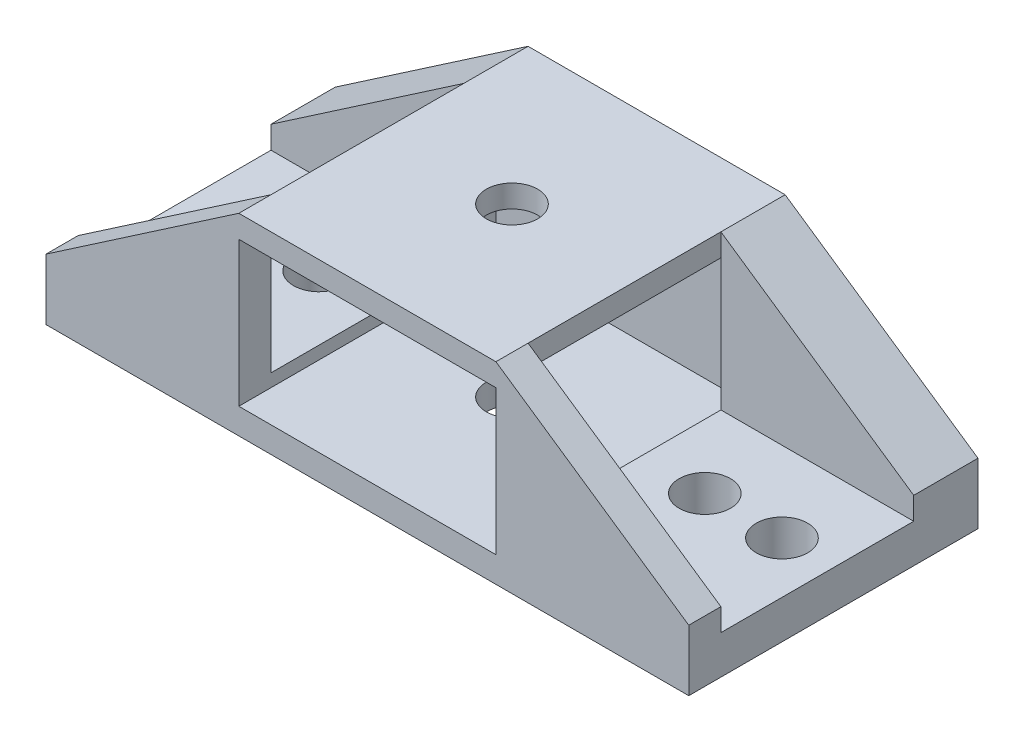
ISO-10303-21;
HEADER;
FILE_DESCRIPTION(('STEP AP214'),'2;1');
FILE_NAME('part.step','',(''),(''),'','','');
FILE_SCHEMA(('AUTOMOTIVE_DESIGN { 1 0 10303 214 1 1 1 1 }'));
ENDSEC;
DATA;
#1=APPLICATION_CONTEXT('core data for automotive mechanical design processes');
#2=APPLICATION_PROTOCOL_DEFINITION('international standard','automotive_design',2000,#1);
#3=PRODUCT_CONTEXT('',#1,'mechanical');
#4=PRODUCT('Part','Part','',(#3));
#5=PRODUCT_RELATED_PRODUCT_CATEGORY('part','',(#4));
#6=PRODUCT_DEFINITION_FORMATION('','',#4);
#7=PRODUCT_DEFINITION_CONTEXT('part definition',#1,'design');
#8=PRODUCT_DEFINITION('design','',#6,#7);
#9=PRODUCT_DEFINITION_SHAPE('','',#8);
#10=(LENGTH_UNIT() NAMED_UNIT(*) SI_UNIT(.MILLI.,.METRE.));
#11=(NAMED_UNIT(*) PLANE_ANGLE_UNIT() SI_UNIT($,.RADIAN.));
#12=(NAMED_UNIT(*) SI_UNIT($,.STERADIAN.) SOLID_ANGLE_UNIT());
#13=UNCERTAINTY_MEASURE_WITH_UNIT(LENGTH_MEASURE(1.E-05),#10,'distance_accuracy_value','');
#14=(GEOMETRIC_REPRESENTATION_CONTEXT(3) GLOBAL_UNCERTAINTY_ASSIGNED_CONTEXT((#13)) GLOBAL_UNIT_ASSIGNED_CONTEXT((#10,
#11,#12)) REPRESENTATION_CONTEXT('',''));
#15=CARTESIAN_POINT('',(0.,0.,0.));
#16=DIRECTION('',(0.,0.,1.));
#17=DIRECTION('',(1.,0.,0.));
#18=AXIS2_PLACEMENT_3D('',#15,#16,#17);
#19=CARTESIAN_POINT('',(0.,3.,0.));
#20=DIRECTION('',(0.,0.,-1.));
#21=DIRECTION('',(-1.,0.,0.));
#22=AXIS2_PLACEMENT_3D('',#19,#20,#21);
#23=PLANE('',#22);
#24=DIRECTION('',(1.,0.,0.));
#25=VECTOR('',#24,1.);
#26=CARTESIAN_POINT('',(0.,2.,0.));
#27=LINE('',#26,#25);
#28=CARTESIAN_POINT('',(15.,2.,0.));
#29=VERTEX_POINT('',#28);
#30=CARTESIAN_POINT('',(35.,2.,0.));
#31=VERTEX_POINT('',#30);
#32=EDGE_CURVE('E260',#29,#31,#27,.T.);
#33=ORIENTED_EDGE('',*,*,#32,.F.);
#34=DIRECTION('',(0.,-1.,0.));
#35=VECTOR('',#34,1.);
#36=CARTESIAN_POINT('',(15.,0.,0.));
#37=LINE('',#36,#35);
#38=CARTESIAN_POINT('',(15.,13.25,0.));
#39=VERTEX_POINT('',#38);
#40=EDGE_CURVE('E242',#39,#29,#37,.T.);
#41=ORIENTED_EDGE('',*,*,#40,.F.);
#42=DIRECTION('',(1.,0.,0.));
#43=VECTOR('',#42,1.);
#44=CARTESIAN_POINT('',(0.,13.25,0.));
#45=LINE('',#44,#43);
#46=CARTESIAN_POINT('',(35.,13.25,0.));
#47=VERTEX_POINT('',#46);
#48=EDGE_CURVE('E249',#39,#47,#45,.T.);
#49=ORIENTED_EDGE('',*,*,#48,.T.);
#50=DIRECTION('',(0.,1.,0.));
#51=VECTOR('',#50,1.);
#52=CARTESIAN_POINT('',(35.,0.,0.));
#53=LINE('',#52,#51);
#54=EDGE_CURVE('E263',#31,#47,#53,.T.);
#55=ORIENTED_EDGE('',*,*,#54,.F.);
#56=EDGE_LOOP('',(#33,#41,#49,#55));
#57=FACE_BOUND('',#56,.T.);
#58=DIRECTION('',(0.,-1.,0.));
#59=VECTOR('',#58,1.);
#60=CARTESIAN_POINT('',(50.,3.,0.));
#61=LINE('',#60,#59);
#62=CARTESIAN_POINT('',(50.,4.75000000000001,0.));
#63=VERTEX_POINT('',#62);
#64=CARTESIAN_POINT('',(50.,0.,0.));
#65=VERTEX_POINT('',#64);
#66=EDGE_CURVE('E197',#63,#65,#61,.T.);
#67=ORIENTED_EDGE('',*,*,#66,.F.);
#68=DIRECTION('',(0.825644641500814,-0.564190505025556,0.));
#69=VECTOR('',#68,1.);
#70=CARTESIAN_POINT('',(18.1281954175345,26.5290664646847,0.));
#71=LINE('',#70,#69);
#72=CARTESIAN_POINT('',(35.,15.,0.));
#73=VERTEX_POINT('',#72);
#74=EDGE_CURVE('E191',#73,#63,#71,.T.);
#75=ORIENTED_EDGE('',*,*,#74,.F.);
#76=DIRECTION('',(1.,0.,0.));
#77=VECTOR('',#76,1.);
#78=CARTESIAN_POINT('',(0.,15.,0.));
#79=LINE('',#78,#77);
#80=CARTESIAN_POINT('',(15.,15.,0.));
#81=VERTEX_POINT('',#80);
#82=EDGE_CURVE('E287',#81,#73,#79,.T.);
#83=ORIENTED_EDGE('',*,*,#82,.F.);
#84=DIRECTION('',(-0.825644641500814,-0.564190505025556,0.));
#85=VECTOR('',#84,1.);
#86=CARTESIAN_POINT('',(-2.21264911948495,3.23802310168529,0.));
#87=LINE('',#86,#85);
#88=CARTESIAN_POINT('',(0.,4.75000000000001,0.));
#89=VERTEX_POINT('',#88);
#90=EDGE_CURVE('E335',#81,#89,#87,.T.);
#91=ORIENTED_EDGE('',*,*,#90,.T.);
#92=DIRECTION('',(0.,-1.,0.));
#93=VECTOR('',#92,1.);
#94=CARTESIAN_POINT('',(0.,3.,0.));
#95=LINE('',#94,#93);
#96=CARTESIAN_POINT('',(0.,0.,0.));
#97=VERTEX_POINT('',#96);
#98=EDGE_CURVE('E201',#89,#97,#95,.T.);
#99=ORIENTED_EDGE('',*,*,#98,.T.);
#100=DIRECTION('',(1.,0.,0.));
#101=VECTOR('',#100,1.);
#102=CARTESIAN_POINT('',(0.,0.,0.));
#103=LINE('',#102,#101);
#104=EDGE_CURVE('E294',#97,#65,#103,.T.);
#105=ORIENTED_EDGE('',*,*,#104,.T.);
#106=EDGE_LOOP('',(#67,#75,#83,#91,#99,#105));
#107=FACE_BOUND('',#106,.T.);
#108=ADVANCED_FACE('F35',(#57,#107),#23,.F.);
#109=CARTESIAN_POINT('',(0.,3.,-22.5));
#110=DIRECTION('',(0.,0.,-1.));
#111=DIRECTION('',(-1.,0.,0.));
#112=AXIS2_PLACEMENT_3D('',#109,#110,#111);
#113=PLANE('',#112);
#114=DIRECTION('',(0.825644641500814,-0.564190505025556,0.));
#115=VECTOR('',#114,1.);
#116=CARTESIAN_POINT('',(18.1281954175345,26.5290664646847,-22.5));
#117=LINE('',#116,#115);
#118=CARTESIAN_POINT('',(35.,15.,-22.5));
#119=VERTEX_POINT('',#118);
#120=CARTESIAN_POINT('',(50.,4.75000000000001,-22.5));
#121=VERTEX_POINT('',#120);
#122=EDGE_CURVE('E173',#119,#121,#117,.T.);
#123=ORIENTED_EDGE('',*,*,#122,.T.);
#124=DIRECTION('',(0.,-1.,0.));
#125=VECTOR('',#124,1.);
#126=CARTESIAN_POINT('',(50.,3.,-22.5));
#127=LINE('',#126,#125);
#128=CARTESIAN_POINT('',(50.,0.,-22.5));
#129=VERTEX_POINT('',#128);
#130=EDGE_CURVE('E186',#121,#129,#127,.T.);
#131=ORIENTED_EDGE('',*,*,#130,.T.);
#132=DIRECTION('',(1.,0.,0.));
#133=VECTOR('',#132,1.);
#134=CARTESIAN_POINT('',(0.,0.,-22.5));
#135=LINE('',#134,#133);
#136=CARTESIAN_POINT('',(0.,0.,-22.5));
#137=VERTEX_POINT('',#136);
#138=EDGE_CURVE('E316',#137,#129,#135,.T.);
#139=ORIENTED_EDGE('',*,*,#138,.F.);
#140=DIRECTION('',(0.,-1.,0.));
#141=VECTOR('',#140,1.);
#142=CARTESIAN_POINT('',(0.,3.,-22.5));
#143=LINE('',#142,#141);
#144=CARTESIAN_POINT('',(0.,4.75000000000001,-22.5));
#145=VERTEX_POINT('',#144);
#146=EDGE_CURVE('E198',#145,#137,#143,.T.);
#147=ORIENTED_EDGE('',*,*,#146,.F.);
#148=DIRECTION('',(-0.825644641500814,-0.564190505025556,0.));
#149=VECTOR('',#148,1.);
#150=CARTESIAN_POINT('',(-2.21264911948495,3.23802310168529,-22.5));
#151=LINE('',#150,#149);
#152=CARTESIAN_POINT('',(15.,15.,-22.5));
#153=VERTEX_POINT('',#152);
#154=EDGE_CURVE('E224',#153,#145,#151,.T.);
#155=ORIENTED_EDGE('',*,*,#154,.F.);
#156=DIRECTION('',(1.,0.,0.));
#157=VECTOR('',#156,1.);
#158=CARTESIAN_POINT('',(0.,15.,-22.5));
#159=LINE('',#158,#157);
#160=EDGE_CURVE('E190',#153,#119,#159,.T.);
#161=ORIENTED_EDGE('',*,*,#160,.T.);
#162=EDGE_LOOP('',(#123,#131,#139,#147,#155,#161));
#163=FACE_BOUND('',#162,.T.);
#164=ADVANCED_FACE('F184',(#163),#113,.T.);
#165=CARTESIAN_POINT('',(0.,3.,0.));
#166=DIRECTION('',(-1.,0.,0.));
#167=DIRECTION('',(0.,0.,1.));
#168=AXIS2_PLACEMENT_3D('',#165,#166,#167);
#169=PLANE('',#168);
#170=ORIENTED_EDGE('',*,*,#98,.F.);
#171=DIRECTION('',(0.,0.,1.));
#172=VECTOR('',#171,1.);
#173=CARTESIAN_POINT('',(0.,4.75000000000001,-40.6676222990242));
#174=LINE('',#173,#172);
#175=CARTESIAN_POINT('',(0.,4.75000000000001,-2.5));
#176=VERTEX_POINT('',#175);
#177=EDGE_CURVE('E209',#176,#89,#174,.T.);
#178=ORIENTED_EDGE('',*,*,#177,.F.);
#179=DIRECTION('',(0.,-1.,0.));
#180=VECTOR('',#179,1.);
#181=CARTESIAN_POINT('',(0.,30.8113883008419,-2.5));
#182=LINE('',#181,#180);
#183=CARTESIAN_POINT('',(0.,3.,-2.5));
#184=VERTEX_POINT('',#183);
#185=EDGE_CURVE('E221',#176,#184,#182,.T.);
#186=ORIENTED_EDGE('',*,*,#185,.T.);
#187=DIRECTION('',(0.,0.,-1.));
#188=VECTOR('',#187,1.);
#189=CARTESIAN_POINT('',(0.,3.,0.));
#190=LINE('',#189,#188);
#191=CARTESIAN_POINT('',(0.,3.,-17.5));
#192=VERTEX_POINT('',#191);
#193=EDGE_CURVE('E298',#184,#192,#190,.T.);
#194=ORIENTED_EDGE('',*,*,#193,.T.);
#195=DIRECTION('',(0.,-1.,0.));
#196=VECTOR('',#195,1.);
#197=CARTESIAN_POINT('',(0.,30.8113883008419,-17.5));
#198=LINE('',#197,#196);
#199=CARTESIAN_POINT('',(0.,4.75000000000001,-17.5));
#200=VERTEX_POINT('',#199);
#201=EDGE_CURVE('E231',#200,#192,#198,.T.);
#202=ORIENTED_EDGE('',*,*,#201,.F.);
#203=EDGE_CURVE('E57',#145,#200,#174,.T.);
#204=ORIENTED_EDGE('',*,*,#203,.F.);
#205=ORIENTED_EDGE('',*,*,#146,.T.);
#206=DIRECTION('',(0.,0.,-1.));
#207=VECTOR('',#206,1.);
#208=CARTESIAN_POINT('',(0.,0.,0.));
#209=LINE('',#208,#207);
#210=EDGE_CURVE('E318',#97,#137,#209,.T.);
#211=ORIENTED_EDGE('',*,*,#210,.F.);
#212=EDGE_LOOP('',(#170,#178,#186,#194,#202,#204,#205,#211));
#213=FACE_BOUND('',#212,.T.);
#214=ADVANCED_FACE('F219',(#213),#169,.T.);
#215=CARTESIAN_POINT('',(0.,15.,0.));
#216=DIRECTION('',(0.,1.,0.));
#217=DIRECTION('',(0.,0.,1.));
#218=AXIS2_PLACEMENT_3D('',#215,#216,#217);
#219=PLANE('',#218);
#220=CARTESIAN_POINT('',(25.,15.,-11.25));
#221=DIRECTION('',(0.,1.,0.));
#222=DIRECTION('',(0.,0.,1.));
#223=AXIS2_PLACEMENT_3D('',#220,#221,#222);
#224=CIRCLE('',#223,2.);
#225=CARTESIAN_POINT('',(25.,15.,-9.25));
#226=VERTEX_POINT('',#225);
#227=EDGE_CURVE('E388',#226,#226,#224,.T.);
#228=ORIENTED_EDGE('',*,*,#227,.F.);
#229=EDGE_LOOP('',(#228));
#230=FACE_BOUND('',#229,.T.);
#231=DIRECTION('',(0.,0.,1.));
#232=VECTOR('',#231,1.);
#233=CARTESIAN_POINT('',(35.,15.,-40.6676222990242));
#234=LINE('',#233,#232);
#235=CARTESIAN_POINT('',(35.,15.,-17.5));
#236=VERTEX_POINT('',#235);
#237=EDGE_CURVE('E348',#119,#236,#234,.T.);
#238=ORIENTED_EDGE('',*,*,#237,.F.);
#239=ORIENTED_EDGE('',*,*,#160,.F.);
#240=DIRECTION('',(0.,0.,1.));
#241=VECTOR('',#240,1.);
#242=CARTESIAN_POINT('',(15.,15.,-40.6676222990242));
#243=LINE('',#242,#241);
#244=CARTESIAN_POINT('',(15.,15.,-17.5));
#245=VERTEX_POINT('',#244);
#246=EDGE_CURVE('E345',#153,#245,#243,.T.);
#247=ORIENTED_EDGE('',*,*,#246,.T.);
#248=DIRECTION('',(0.,0.,1.));
#249=VECTOR('',#248,1.);
#250=CARTESIAN_POINT('',(15.,15.,0.));
#251=LINE('',#250,#249);
#252=CARTESIAN_POINT('',(15.,15.,-2.5));
#253=VERTEX_POINT('',#252);
#254=EDGE_CURVE('E284',#245,#253,#251,.T.);
#255=ORIENTED_EDGE('',*,*,#254,.T.);
#256=EDGE_CURVE('E212',#253,#81,#243,.T.);
#257=ORIENTED_EDGE('',*,*,#256,.T.);
#258=ORIENTED_EDGE('',*,*,#82,.T.);
#259=CARTESIAN_POINT('',(35.,15.,-2.5));
#260=VERTEX_POINT('',#259);
#261=EDGE_CURVE('E180',#260,#73,#234,.T.);
#262=ORIENTED_EDGE('',*,*,#261,.F.);
#263=DIRECTION('',(0.,0.,1.));
#264=VECTOR('',#263,1.);
#265=CARTESIAN_POINT('',(35.,15.,0.));
#266=LINE('',#265,#264);
#267=EDGE_CURVE('E269',#236,#260,#266,.T.);
#268=ORIENTED_EDGE('',*,*,#267,.F.);
#269=EDGE_LOOP('',(#238,#239,#247,#255,#257,#258,#262,#268));
#270=FACE_BOUND('',#269,.T.);
#271=ADVANCED_FACE('F344',(#230,#270),#219,.T.);
#272=CARTESIAN_POINT('',(0.,30.8113883008419,-17.5));
#273=DIRECTION('',(0.,0.,1.));
#274=DIRECTION('',(1.,0.,0.));
#275=AXIS2_PLACEMENT_3D('',#272,#273,#274);
#276=PLANE('',#275);
#277=DIRECTION('',(0.,-1.,0.));
#278=VECTOR('',#277,1.);
#279=CARTESIAN_POINT('',(15.,30.8113883008419,-17.5));
#280=LINE('',#279,#278);
#281=CARTESIAN_POINT('',(15.,13.25,-17.5));
#282=VERTEX_POINT('',#281);
#283=EDGE_CURVE('E243',#245,#282,#280,.T.);
#284=ORIENTED_EDGE('',*,*,#283,.F.);
#285=DIRECTION('',(-0.825644641500814,-0.564190505025556,0.));
#286=VECTOR('',#285,1.);
#287=CARTESIAN_POINT('',(12.1399385002975,13.04562464187,-17.5));
#288=LINE('',#287,#286);
#289=EDGE_CURVE('E353',#245,#200,#288,.T.);
#290=ORIENTED_EDGE('',*,*,#289,.T.);
#291=ORIENTED_EDGE('',*,*,#201,.T.);
#292=DIRECTION('',(-1.,0.,0.));
#293=VECTOR('',#292,1.);
#294=CARTESIAN_POINT('',(0.,3.,-17.5));
#295=LINE('',#294,#293);
#296=CARTESIAN_POINT('',(15.,3.,-17.5));
#297=VERTEX_POINT('',#296);
#298=EDGE_CURVE('E239',#297,#192,#295,.T.);
#299=ORIENTED_EDGE('',*,*,#298,.F.);
#300=EDGE_CURVE('E233',#282,#297,#280,.T.);
#301=ORIENTED_EDGE('',*,*,#300,.F.);
#302=EDGE_LOOP('',(#284,#290,#291,#299,#301));
#303=FACE_BOUND('',#302,.T.);
#304=ADVANCED_FACE('F468',(#303),#276,.T.);
#305=CARTESIAN_POINT('',(0.,30.8113883008419,-2.5));
#306=DIRECTION('',(0.,0.,1.));
#307=DIRECTION('',(1.,0.,0.));
#308=AXIS2_PLACEMENT_3D('',#305,#306,#307);
#309=PLANE('',#308);
#310=DIRECTION('',(-0.825644641500814,-0.564190505025556,0.));
#311=VECTOR('',#310,1.);
#312=CARTESIAN_POINT('',(12.1399385002975,13.04562464187,-2.5));
#313=LINE('',#312,#311);
#314=EDGE_CURVE('E43',#253,#176,#313,.T.);
#315=ORIENTED_EDGE('',*,*,#314,.F.);
#316=DIRECTION('',(0.,-1.,0.));
#317=VECTOR('',#316,1.);
#318=CARTESIAN_POINT('',(15.,30.8113883008419,-2.5));
#319=LINE('',#318,#317);
#320=CARTESIAN_POINT('',(15.,13.25,-2.5));
#321=VERTEX_POINT('',#320);
#322=EDGE_CURVE('E235',#253,#321,#319,.T.);
#323=ORIENTED_EDGE('',*,*,#322,.T.);
#324=CARTESIAN_POINT('',(15.,3.,-2.5));
#325=VERTEX_POINT('',#324);
#326=EDGE_CURVE('E374',#321,#325,#319,.T.);
#327=ORIENTED_EDGE('',*,*,#326,.T.);
#328=DIRECTION('',(-1.,0.,0.));
#329=VECTOR('',#328,1.);
#330=CARTESIAN_POINT('',(0.,3.,-2.5));
#331=LINE('',#330,#329);
#332=EDGE_CURVE('E230',#325,#184,#331,.T.);
#333=ORIENTED_EDGE('',*,*,#332,.T.);
#334=ORIENTED_EDGE('',*,*,#185,.F.);
#335=EDGE_LOOP('',(#315,#323,#327,#333,#334));
#336=FACE_BOUND('',#335,.T.);
#337=ADVANCED_FACE('F227',(#336),#309,.F.);
#338=CARTESIAN_POINT('',(35.,15.,0.));
#339=DIRECTION('',(1.,0.,0.));
#340=DIRECTION('',(0.,0.,-1.));
#341=AXIS2_PLACEMENT_3D('',#338,#339,#340);
#342=PLANE('',#341);
#343=DIRECTION('',(0.,-1.,0.));
#344=VECTOR('',#343,1.);
#345=CARTESIAN_POINT('',(35.,30.8113883008419,-2.5));
#346=LINE('',#345,#344);
#347=CARTESIAN_POINT('',(35.,13.25,-2.5));
#348=VERTEX_POINT('',#347);
#349=EDGE_CURVE('E361',#260,#348,#346,.T.);
#350=ORIENTED_EDGE('',*,*,#349,.T.);
#351=DIRECTION('',(0.,0.,1.));
#352=VECTOR('',#351,1.);
#353=CARTESIAN_POINT('',(35.,13.25,-20.));
#354=LINE('',#353,#352);
#355=CARTESIAN_POINT('',(35.,13.25,-17.5));
#356=VERTEX_POINT('',#355);
#357=EDGE_CURVE('E275',#356,#348,#354,.T.);
#358=ORIENTED_EDGE('',*,*,#357,.F.);
#359=DIRECTION('',(0.,-1.,0.));
#360=VECTOR('',#359,1.);
#361=CARTESIAN_POINT('',(35.,30.8113883008419,-17.5));
#362=LINE('',#361,#360);
#363=EDGE_CURVE('E371',#236,#356,#362,.T.);
#364=ORIENTED_EDGE('',*,*,#363,.F.);
#365=ORIENTED_EDGE('',*,*,#267,.T.);
#366=EDGE_LOOP('',(#350,#358,#364,#365));
#367=FACE_BOUND('',#366,.T.);
#368=ADVANCED_FACE('F444',(#367),#342,.T.);
#369=CARTESIAN_POINT('',(0.,3.,0.));
#370=DIRECTION('',(0.,1.,0.));
#371=DIRECTION('',(0.,0.,1.));
#372=AXIS2_PLACEMENT_3D('',#369,#370,#371);
#373=PLANE('',#372);
#374=DIRECTION('',(1.,0.,0.));
#375=VECTOR('',#374,1.);
#376=CARTESIAN_POINT('',(0.,3.,-2.5));
#377=LINE('',#376,#375);
#378=CARTESIAN_POINT('',(35.,3.,-2.5));
#379=VERTEX_POINT('',#378);
#380=CARTESIAN_POINT('',(50.,3.,-2.5));
#381=VERTEX_POINT('',#380);
#382=EDGE_CURVE('E357',#379,#381,#377,.T.);
#383=ORIENTED_EDGE('',*,*,#382,.T.);
#384=DIRECTION('',(0.,0.,-1.));
#385=VECTOR('',#384,1.);
#386=CARTESIAN_POINT('',(50.,3.,0.));
#387=LINE('',#386,#385);
#388=CARTESIAN_POINT('',(50.,3.,-17.5));
#389=VERTEX_POINT('',#388);
#390=EDGE_CURVE('E295',#381,#389,#387,.T.);
#391=ORIENTED_EDGE('',*,*,#390,.T.);
#392=DIRECTION('',(1.,0.,0.));
#393=VECTOR('',#392,1.);
#394=CARTESIAN_POINT('',(0.,3.,-17.5));
#395=LINE('',#394,#393);
#396=CARTESIAN_POINT('',(35.,3.,-17.5));
#397=VERTEX_POINT('',#396);
#398=EDGE_CURVE('E367',#397,#389,#395,.T.);
#399=ORIENTED_EDGE('',*,*,#398,.F.);
#400=DIRECTION('',(0.,0.,-1.));
#401=VECTOR('',#400,1.);
#402=CARTESIAN_POINT('',(35.,3.,0.));
#403=LINE('',#402,#401);
#404=EDGE_CURVE('E292',#379,#397,#403,.T.);
#405=ORIENTED_EDGE('',*,*,#404,.F.);
#406=EDGE_LOOP('',(#383,#391,#399,#405));
#407=FACE_BOUND('',#406,.T.);
#408=CARTESIAN_POINT('',(40.,3.,-11.25));
#409=DIRECTION('',(0.,1.,0.));
#410=DIRECTION('',(0.,0.,1.));
#411=AXIS2_PLACEMENT_3D('',#408,#409,#410);
#412=CIRCLE('',#411,2.);
#413=CARTESIAN_POINT('',(40.,3.,-9.25));
#414=VERTEX_POINT('',#413);
#415=EDGE_CURVE('E301',#414,#414,#412,.T.);
#416=ORIENTED_EDGE('',*,*,#415,.F.);
#417=EDGE_LOOP('',(#416));
#418=FACE_BOUND('',#417,.T.);
#419=CARTESIAN_POINT('',(46.,3.,-11.25));
#420=DIRECTION('',(0.,1.,0.));
#421=DIRECTION('',(0.,0.,1.));
#422=AXIS2_PLACEMENT_3D('',#419,#420,#421);
#423=CIRCLE('',#422,2.);
#424=CARTESIAN_POINT('',(46.,3.,-9.25));
#425=VERTEX_POINT('',#424);
#426=EDGE_CURVE('E304',#425,#425,#423,.T.);
#427=ORIENTED_EDGE('',*,*,#426,.F.);
#428=EDGE_LOOP('',(#427));
#429=FACE_BOUND('',#428,.T.);
#430=ADVANCED_FACE('F451',(#407,#418,#429),#373,.T.);
#431=CARTESIAN_POINT('',(15.,15.,0.));
#432=DIRECTION('',(1.,0.,0.));
#433=DIRECTION('',(0.,0.,-1.));
#434=AXIS2_PLACEMENT_3D('',#431,#432,#433);
#435=PLANE('',#434);
#436=ORIENTED_EDGE('',*,*,#322,.F.);
#437=ORIENTED_EDGE('',*,*,#254,.F.);
#438=ORIENTED_EDGE('',*,*,#283,.T.);
#439=DIRECTION('',(0.,0.,1.));
#440=VECTOR('',#439,1.);
#441=CARTESIAN_POINT('',(15.,13.25,-20.));
#442=LINE('',#441,#440);
#443=EDGE_CURVE('E270',#282,#321,#442,.T.);
#444=ORIENTED_EDGE('',*,*,#443,.T.);
#445=EDGE_LOOP('',(#436,#437,#438,#444));
#446=FACE_BOUND('',#445,.T.);
#447=ADVANCED_FACE('F380',(#446),#435,.F.);
#448=CARTESIAN_POINT('',(10.,3.,-11.25));
#449=DIRECTION('',(0.,1.,0.));
#450=DIRECTION('',(0.,0.,1.));
#451=AXIS2_PLACEMENT_3D('',#448,#449,#450);
#452=CIRCLE('',#451,2.);
#453=CARTESIAN_POINT('',(10.,3.,-9.25));
#454=VERTEX_POINT('',#453);
#455=EDGE_CURVE('E310',#454,#454,#452,.T.);
#456=ORIENTED_EDGE('',*,*,#455,.F.);
#457=EDGE_LOOP('',(#456));
#458=FACE_BOUND('',#457,.T.);
#459=CARTESIAN_POINT('',(4.,3.,-11.25));
#460=DIRECTION('',(0.,1.,0.));
#461=DIRECTION('',(0.,0.,1.));
#462=AXIS2_PLACEMENT_3D('',#459,#460,#461);
#463=CIRCLE('',#462,2.);
#464=CARTESIAN_POINT('',(4.,3.,-9.25));
#465=VERTEX_POINT('',#464);
#466=EDGE_CURVE('E307',#465,#465,#463,.T.);
#467=ORIENTED_EDGE('',*,*,#466,.F.);
#468=EDGE_LOOP('',(#467));
#469=FACE_BOUND('',#468,.T.);
#470=ORIENTED_EDGE('',*,*,#193,.F.);
#471=ORIENTED_EDGE('',*,*,#332,.F.);
#472=DIRECTION('',(0.,0.,-1.));
#473=VECTOR('',#472,1.);
#474=CARTESIAN_POINT('',(15.,3.,0.));
#475=LINE('',#474,#473);
#476=EDGE_CURVE('E290',#325,#297,#475,.T.);
#477=ORIENTED_EDGE('',*,*,#476,.T.);
#478=ORIENTED_EDGE('',*,*,#298,.T.);
#479=EDGE_LOOP('',(#470,#471,#477,#478));
#480=FACE_BOUND('',#479,.T.);
#481=ADVANCED_FACE('F489',(#458,#469,#480),#373,.T.);
#482=CARTESIAN_POINT('',(50.,3.,0.));
#483=DIRECTION('',(-1.,0.,0.));
#484=DIRECTION('',(0.,0.,1.));
#485=AXIS2_PLACEMENT_3D('',#482,#483,#484);
#486=PLANE('',#485);
#487=ORIENTED_EDGE('',*,*,#130,.F.);
#488=DIRECTION('',(0.,0.,1.));
#489=VECTOR('',#488,1.);
#490=CARTESIAN_POINT('',(50.,4.75000000000001,-40.6676222990242));
#491=LINE('',#490,#489);
#492=CARTESIAN_POINT('',(50.,4.75000000000001,-17.5));
#493=VERTEX_POINT('',#492);
#494=EDGE_CURVE('E170',#121,#493,#491,.T.);
#495=ORIENTED_EDGE('',*,*,#494,.T.);
#496=DIRECTION('',(0.,-1.,0.));
#497=VECTOR('',#496,1.);
#498=CARTESIAN_POINT('',(50.,30.8113883008419,-17.5));
#499=LINE('',#498,#497);
#500=EDGE_CURVE('E370',#493,#389,#499,.T.);
#501=ORIENTED_EDGE('',*,*,#500,.T.);
#502=ORIENTED_EDGE('',*,*,#390,.F.);
#503=DIRECTION('',(0.,-1.,0.));
#504=VECTOR('',#503,1.);
#505=CARTESIAN_POINT('',(50.,30.8113883008419,-2.5));
#506=LINE('',#505,#504);
#507=CARTESIAN_POINT('',(50.,4.75000000000001,-2.5));
#508=VERTEX_POINT('',#507);
#509=EDGE_CURVE('E364',#508,#381,#506,.T.);
#510=ORIENTED_EDGE('',*,*,#509,.F.);
#511=EDGE_CURVE('E49',#508,#63,#491,.T.);
#512=ORIENTED_EDGE('',*,*,#511,.T.);
#513=ORIENTED_EDGE('',*,*,#66,.T.);
#514=DIRECTION('',(0.,0.,-1.));
#515=VECTOR('',#514,1.);
#516=CARTESIAN_POINT('',(50.,0.,0.));
#517=LINE('',#516,#515);
#518=EDGE_CURVE('E196',#65,#129,#517,.T.);
#519=ORIENTED_EDGE('',*,*,#518,.T.);
#520=EDGE_LOOP('',(#487,#495,#501,#502,#510,#512,#513,#519));
#521=FACE_BOUND('',#520,.T.);
#522=ADVANCED_FACE('F194',(#521),#486,.F.);
#523=CARTESIAN_POINT('',(4.,3.,-11.25));
#524=DIRECTION('',(0.,-1.,0.));
#525=DIRECTION('',(0.,0.,-1.));
#526=AXIS2_PLACEMENT_3D('',#523,#524,#525);
#527=CYLINDRICAL_SURFACE('',#526,2.);
#528=ORIENTED_EDGE('',*,*,#466,.T.);
#529=EDGE_LOOP('',(#528));
#530=FACE_BOUND('',#529,.T.);
#531=CARTESIAN_POINT('',(4.,0.,-11.25));
#532=DIRECTION('',(0.,1.,0.));
#533=DIRECTION('',(0.,0.,1.));
#534=AXIS2_PLACEMENT_3D('',#531,#532,#533);
#535=CIRCLE('',#534,2.);
#536=CARTESIAN_POINT('',(4.,0.,-9.25));
#537=VERTEX_POINT('',#536);
#538=EDGE_CURVE('E327',#537,#537,#535,.T.);
#539=ORIENTED_EDGE('',*,*,#538,.F.);
#540=EDGE_LOOP('',(#539));
#541=FACE_BOUND('',#540,.T.);
#542=ADVANCED_FACE('F501',(#530,#541),#527,.F.);
#543=CARTESIAN_POINT('',(46.,3.,-11.25));
#544=DIRECTION('',(0.,-1.,0.));
#545=DIRECTION('',(0.,0.,-1.));
#546=AXIS2_PLACEMENT_3D('',#543,#544,#545);
#547=CYLINDRICAL_SURFACE('',#546,2.);
#548=ORIENTED_EDGE('',*,*,#426,.T.);
#549=EDGE_LOOP('',(#548));
#550=FACE_BOUND('',#549,.T.);
#551=CARTESIAN_POINT('',(46.,0.,-11.25));
#552=DIRECTION('',(0.,1.,0.));
#553=DIRECTION('',(0.,0.,1.));
#554=AXIS2_PLACEMENT_3D('',#551,#552,#553);
#555=CIRCLE('',#554,2.);
#556=CARTESIAN_POINT('',(46.,0.,-9.25));
#557=VERTEX_POINT('',#556);
#558=EDGE_CURVE('E324',#557,#557,#555,.T.);
#559=ORIENTED_EDGE('',*,*,#558,.F.);
#560=EDGE_LOOP('',(#559));
#561=FACE_BOUND('',#560,.T.);
#562=ADVANCED_FACE('F504',(#550,#561),#547,.F.);
#563=CARTESIAN_POINT('',(40.,3.,-11.25));
#564=DIRECTION('',(0.,-1.,0.));
#565=DIRECTION('',(0.,0.,-1.));
#566=AXIS2_PLACEMENT_3D('',#563,#564,#565);
#567=CYLINDRICAL_SURFACE('',#566,2.);
#568=ORIENTED_EDGE('',*,*,#415,.T.);
#569=EDGE_LOOP('',(#568));
#570=FACE_BOUND('',#569,.T.);
#571=CARTESIAN_POINT('',(40.,0.,-11.25));
#572=DIRECTION('',(0.,1.,0.));
#573=DIRECTION('',(0.,0.,1.));
#574=AXIS2_PLACEMENT_3D('',#571,#572,#573);
#575=CIRCLE('',#574,2.);
#576=CARTESIAN_POINT('',(40.,0.,-9.25));
#577=VERTEX_POINT('',#576);
#578=EDGE_CURVE('E321',#577,#577,#575,.T.);
#579=ORIENTED_EDGE('',*,*,#578,.F.);
#580=EDGE_LOOP('',(#579));
#581=FACE_BOUND('',#580,.T.);
#582=ADVANCED_FACE('F499',(#570,#581),#567,.F.);
#583=CARTESIAN_POINT('',(10.,3.,-11.25));
#584=DIRECTION('',(0.,-1.,0.));
#585=DIRECTION('',(0.,0.,-1.));
#586=AXIS2_PLACEMENT_3D('',#583,#584,#585);
#587=CYLINDRICAL_SURFACE('',#586,2.);
#588=ORIENTED_EDGE('',*,*,#455,.T.);
#589=EDGE_LOOP('',(#588));
#590=FACE_BOUND('',#589,.T.);
#591=CARTESIAN_POINT('',(10.,0.,-11.25));
#592=DIRECTION('',(0.,1.,0.));
#593=DIRECTION('',(0.,0.,1.));
#594=AXIS2_PLACEMENT_3D('',#591,#592,#593);
#595=CIRCLE('',#594,2.);
#596=CARTESIAN_POINT('',(10.,0.,-9.25));
#597=VERTEX_POINT('',#596);
#598=EDGE_CURVE('E299',#597,#597,#595,.T.);
#599=ORIENTED_EDGE('',*,*,#598,.F.);
#600=EDGE_LOOP('',(#599));
#601=FACE_BOUND('',#600,.T.);
#602=ADVANCED_FACE('F496',(#590,#601),#587,.F.);
#603=CARTESIAN_POINT('',(0.,0.,0.));
#604=DIRECTION('',(0.,1.,0.));
#605=DIRECTION('',(0.,0.,1.));
#606=AXIS2_PLACEMENT_3D('',#603,#604,#605);
#607=PLANE('',#606);
#608=CARTESIAN_POINT('',(25.,0.,-11.25));
#609=DIRECTION('',(0.,1.,0.));
#610=DIRECTION('',(0.,0.,1.));
#611=AXIS2_PLACEMENT_3D('',#608,#609,#610);
#612=CIRCLE('',#611,2.);
#613=CARTESIAN_POINT('',(25.,0.,-9.25));
#614=VERTEX_POINT('',#613);
#615=EDGE_CURVE('E391',#614,#614,#612,.T.);
#616=ORIENTED_EDGE('',*,*,#615,.T.);
#617=EDGE_LOOP('',(#616));
#618=FACE_BOUND('',#617,.T.);
#619=ORIENTED_EDGE('',*,*,#518,.F.);
#620=ORIENTED_EDGE('',*,*,#104,.F.);
#621=ORIENTED_EDGE('',*,*,#210,.T.);
#622=ORIENTED_EDGE('',*,*,#138,.T.);
#623=EDGE_LOOP('',(#619,#620,#621,#622));
#624=FACE_BOUND('',#623,.T.);
#625=ORIENTED_EDGE('',*,*,#578,.T.);
#626=EDGE_LOOP('',(#625));
#627=FACE_BOUND('',#626,.T.);
#628=ORIENTED_EDGE('',*,*,#558,.T.);
#629=EDGE_LOOP('',(#628));
#630=FACE_BOUND('',#629,.T.);
#631=ORIENTED_EDGE('',*,*,#598,.T.);
#632=EDGE_LOOP('',(#631));
#633=FACE_BOUND('',#632,.T.);
#634=ORIENTED_EDGE('',*,*,#538,.T.);
#635=EDGE_LOOP('',(#634));
#636=FACE_BOUND('',#635,.T.);
#637=ADVANCED_FACE('F337',(#618,#624,#627,#630,#633,#636),#607,.F.);
#638=CARTESIAN_POINT('',(15.,0.,-20.));
#639=DIRECTION('',(-1.,0.,0.));
#640=DIRECTION('',(0.,0.,1.));
#641=AXIS2_PLACEMENT_3D('',#638,#639,#640);
#642=PLANE('',#641);
#643=ORIENTED_EDGE('',*,*,#476,.F.);
#644=ORIENTED_EDGE('',*,*,#326,.F.);
#645=EDGE_CURVE('E271',#321,#39,#442,.T.);
#646=ORIENTED_EDGE('',*,*,#645,.T.);
#647=ORIENTED_EDGE('',*,*,#40,.T.);
#648=DIRECTION('',(0.,0.,1.));
#649=VECTOR('',#648,1.);
#650=CARTESIAN_POINT('',(15.,2.,-20.));
#651=LINE('',#650,#649);
#652=CARTESIAN_POINT('',(15.,2.,-20.));
#653=VERTEX_POINT('',#652);
#654=EDGE_CURVE('E258',#653,#29,#651,.T.);
#655=ORIENTED_EDGE('',*,*,#654,.F.);
#656=DIRECTION('',(0.,-1.,0.));
#657=VECTOR('',#656,1.);
#658=CARTESIAN_POINT('',(15.,0.,-20.));
#659=LINE('',#658,#657);
#660=CARTESIAN_POINT('',(15.,13.25,-20.));
#661=VERTEX_POINT('',#660);
#662=EDGE_CURVE('E246',#661,#653,#659,.T.);
#663=ORIENTED_EDGE('',*,*,#662,.F.);
#664=EDGE_CURVE('E267',#661,#282,#442,.T.);
#665=ORIENTED_EDGE('',*,*,#664,.T.);
#666=ORIENTED_EDGE('',*,*,#300,.T.);
#667=EDGE_LOOP('',(#643,#644,#646,#647,#655,#663,#665,#666));
#668=FACE_BOUND('',#667,.T.);
#669=ADVANCED_FACE('F426',(#668),#642,.F.);
#670=CARTESIAN_POINT('',(0.,13.25,-20.));
#671=DIRECTION('',(0.,-1.,0.));
#672=DIRECTION('',(1.,0.,0.));
#673=AXIS2_PLACEMENT_3D('',#670,#671,#672);
#674=PLANE('',#673);
#675=CARTESIAN_POINT('',(25.,13.25,-11.25));
#676=DIRECTION('',(0.,-1.,0.));
#677=DIRECTION('',(1.,0.,0.));
#678=AXIS2_PLACEMENT_3D('',#675,#676,#677);
#679=CIRCLE('',#678,2.);
#680=CARTESIAN_POINT('',(27.,13.25,-11.25));
#681=VERTEX_POINT('',#680);
#682=EDGE_CURVE('E383',#681,#681,#679,.T.);
#683=ORIENTED_EDGE('',*,*,#682,.F.);
#684=EDGE_LOOP('',(#683));
#685=FACE_BOUND('',#684,.T.);
#686=ORIENTED_EDGE('',*,*,#48,.F.);
#687=ORIENTED_EDGE('',*,*,#645,.F.);
#688=ORIENTED_EDGE('',*,*,#443,.F.);
#689=ORIENTED_EDGE('',*,*,#664,.F.);
#690=DIRECTION('',(1.,0.,0.));
#691=VECTOR('',#690,1.);
#692=CARTESIAN_POINT('',(0.,13.25,-20.));
#693=LINE('',#692,#691);
#694=CARTESIAN_POINT('',(35.,13.25,-20.));
#695=VERTEX_POINT('',#694);
#696=EDGE_CURVE('E255',#661,#695,#693,.T.);
#697=ORIENTED_EDGE('',*,*,#696,.T.);
#698=EDGE_CURVE('E272',#695,#356,#354,.T.);
#699=ORIENTED_EDGE('',*,*,#698,.T.);
#700=ORIENTED_EDGE('',*,*,#357,.T.);
#701=EDGE_CURVE('E276',#348,#47,#354,.T.);
#702=ORIENTED_EDGE('',*,*,#701,.T.);
#703=EDGE_LOOP('',(#686,#687,#688,#689,#697,#699,#700,#702));
#704=FACE_BOUND('',#703,.T.);
#705=ADVANCED_FACE('F430',(#685,#704),#674,.T.);
#706=CARTESIAN_POINT('',(35.,0.,-20.));
#707=DIRECTION('',(1.,0.,0.));
#708=DIRECTION('',(0.,0.,-1.));
#709=AXIS2_PLACEMENT_3D('',#706,#707,#708);
#710=PLANE('',#709);
#711=ORIENTED_EDGE('',*,*,#54,.T.);
#712=ORIENTED_EDGE('',*,*,#701,.F.);
#713=EDGE_CURVE('E360',#348,#379,#346,.T.);
#714=ORIENTED_EDGE('',*,*,#713,.T.);
#715=ORIENTED_EDGE('',*,*,#404,.T.);
#716=EDGE_CURVE('E366',#356,#397,#362,.T.);
#717=ORIENTED_EDGE('',*,*,#716,.F.);
#718=ORIENTED_EDGE('',*,*,#698,.F.);
#719=DIRECTION('',(0.,1.,0.));
#720=VECTOR('',#719,1.);
#721=CARTESIAN_POINT('',(35.,0.,-20.));
#722=LINE('',#721,#720);
#723=CARTESIAN_POINT('',(35.,2.,-20.));
#724=VERTEX_POINT('',#723);
#725=EDGE_CURVE('E252',#724,#695,#722,.T.);
#726=ORIENTED_EDGE('',*,*,#725,.F.);
#727=DIRECTION('',(0.,0.,1.));
#728=VECTOR('',#727,1.);
#729=CARTESIAN_POINT('',(35.,2.,-20.));
#730=LINE('',#729,#728);
#731=EDGE_CURVE('E277',#724,#31,#730,.T.);
#732=ORIENTED_EDGE('',*,*,#731,.T.);
#733=EDGE_LOOP('',(#711,#712,#714,#715,#717,#718,#726,#732));
#734=FACE_BOUND('',#733,.T.);
#735=ADVANCED_FACE('F438',(#734),#710,.F.);
#736=CARTESIAN_POINT('',(0.,2.,-20.));
#737=DIRECTION('',(0.,-1.,0.));
#738=DIRECTION('',(0.,0.,-1.));
#739=AXIS2_PLACEMENT_3D('',#736,#737,#738);
#740=PLANE('',#739);
#741=CARTESIAN_POINT('',(25.,2.,-11.25));
#742=DIRECTION('',(0.,-1.,0.));
#743=DIRECTION('',(0.,0.,-1.));
#744=AXIS2_PLACEMENT_3D('',#741,#742,#743);
#745=CIRCLE('',#744,2.);
#746=CARTESIAN_POINT('',(25.,2.,-13.25));
#747=VERTEX_POINT('',#746);
#748=EDGE_CURVE('E38',#747,#747,#745,.T.);
#749=ORIENTED_EDGE('',*,*,#748,.T.);
#750=EDGE_LOOP('',(#749));
#751=FACE_BOUND('',#750,.T.);
#752=ORIENTED_EDGE('',*,*,#32,.T.);
#753=ORIENTED_EDGE('',*,*,#731,.F.);
#754=DIRECTION('',(1.,0.,0.));
#755=VECTOR('',#754,1.);
#756=CARTESIAN_POINT('',(0.,2.,-20.));
#757=LINE('',#756,#755);
#758=EDGE_CURVE('E248',#653,#724,#757,.T.);
#759=ORIENTED_EDGE('',*,*,#758,.F.);
#760=ORIENTED_EDGE('',*,*,#654,.T.);
#761=EDGE_LOOP('',(#752,#753,#759,#760));
#762=FACE_BOUND('',#761,.T.);
#763=ADVANCED_FACE('F398',(#751,#762),#740,.F.);
#764=CARTESIAN_POINT('',(0.,0.,-20.));
#765=DIRECTION('',(0.,0.,1.));
#766=DIRECTION('',(1.,0.,0.));
#767=AXIS2_PLACEMENT_3D('',#764,#765,#766);
#768=PLANE('',#767);
#769=ORIENTED_EDGE('',*,*,#662,.T.);
#770=ORIENTED_EDGE('',*,*,#758,.T.);
#771=ORIENTED_EDGE('',*,*,#725,.T.);
#772=ORIENTED_EDGE('',*,*,#696,.F.);
#773=EDGE_LOOP('',(#769,#770,#771,#772));
#774=FACE_BOUND('',#773,.T.);
#775=ADVANCED_FACE('F465',(#774),#768,.T.);
#776=CARTESIAN_POINT('',(0.,30.8113883008419,-17.5));
#777=DIRECTION('',(0.,0.,-1.));
#778=DIRECTION('',(-1.,0.,0.));
#779=AXIS2_PLACEMENT_3D('',#776,#777,#778);
#780=PLANE('',#779);
#781=ORIENTED_EDGE('',*,*,#500,.F.);
#782=DIRECTION('',(-0.825644641500814,0.564190505025556,0.));
#783=VECTOR('',#782,1.);
#784=CARTESIAN_POINT('',(3.77560779775211,36.3366680048694,-17.5));
#785=LINE('',#784,#783);
#786=EDGE_CURVE('E176',#493,#236,#785,.T.);
#787=ORIENTED_EDGE('',*,*,#786,.T.);
#788=ORIENTED_EDGE('',*,*,#363,.T.);
#789=ORIENTED_EDGE('',*,*,#716,.T.);
#790=ORIENTED_EDGE('',*,*,#398,.T.);
#791=EDGE_LOOP('',(#781,#787,#788,#789,#790));
#792=FACE_BOUND('',#791,.T.);
#793=ADVANCED_FACE('F448',(#792),#780,.F.);
#794=CARTESIAN_POINT('',(0.,30.8113883008419,-2.5));
#795=DIRECTION('',(0.,0.,-1.));
#796=DIRECTION('',(-1.,0.,0.));
#797=AXIS2_PLACEMENT_3D('',#794,#795,#796);
#798=PLANE('',#797);
#799=DIRECTION('',(-0.825644641500814,0.564190505025556,0.));
#800=VECTOR('',#799,1.);
#801=CARTESIAN_POINT('',(3.77560779775211,36.3366680048694,-2.5));
#802=LINE('',#801,#800);
#803=EDGE_CURVE('E11',#508,#260,#802,.T.);
#804=ORIENTED_EDGE('',*,*,#803,.F.);
#805=ORIENTED_EDGE('',*,*,#509,.T.);
#806=ORIENTED_EDGE('',*,*,#382,.F.);
#807=ORIENTED_EDGE('',*,*,#713,.F.);
#808=ORIENTED_EDGE('',*,*,#349,.F.);
#809=EDGE_LOOP('',(#804,#805,#806,#807,#808));
#810=FACE_BOUND('',#809,.T.);
#811=ADVANCED_FACE('F442',(#810),#798,.T.);
#812=CARTESIAN_POINT('',(-2.21264911948495,3.23802310168529,-40.6676222990242));
#813=DIRECTION('',(-0.564190505025556,0.825644641500814,0.));
#814=DIRECTION('',(-0.825644641500814,-0.564190505025556,0.));
#815=AXIS2_PLACEMENT_3D('',#812,#813,#814);
#816=PLANE('',#815);
#817=ORIENTED_EDGE('',*,*,#314,.T.);
#818=ORIENTED_EDGE('',*,*,#177,.T.);
#819=ORIENTED_EDGE('',*,*,#90,.F.);
#820=ORIENTED_EDGE('',*,*,#256,.F.);
#821=EDGE_LOOP('',(#817,#818,#819,#820));
#822=FACE_BOUND('',#821,.T.);
#823=ADVANCED_FACE('F208',(#822),#816,.T.);
#824=ORIENTED_EDGE('',*,*,#246,.F.);
#825=ORIENTED_EDGE('',*,*,#154,.T.);
#826=ORIENTED_EDGE('',*,*,#203,.T.);
#827=ORIENTED_EDGE('',*,*,#289,.F.);
#828=EDGE_LOOP('',(#824,#825,#826,#827));
#829=FACE_BOUND('',#828,.T.);
#830=ADVANCED_FACE('F455',(#829),#816,.T.);
#831=CARTESIAN_POINT('',(18.1281954175345,26.5290664646847,-40.6676222990242));
#832=DIRECTION('',(-0.564190505025556,-0.825644641500814,0.));
#833=DIRECTION('',(0.825644641500814,-0.564190505025556,0.));
#834=AXIS2_PLACEMENT_3D('',#831,#832,#833);
#835=PLANE('',#834);
#836=ORIENTED_EDGE('',*,*,#803,.T.);
#837=ORIENTED_EDGE('',*,*,#261,.T.);
#838=ORIENTED_EDGE('',*,*,#74,.T.);
#839=ORIENTED_EDGE('',*,*,#511,.F.);
#840=EDGE_LOOP('',(#836,#837,#838,#839));
#841=FACE_BOUND('',#840,.T.);
#842=ADVANCED_FACE('F411',(#841),#835,.F.);
#843=ORIENTED_EDGE('',*,*,#494,.F.);
#844=ORIENTED_EDGE('',*,*,#122,.F.);
#845=ORIENTED_EDGE('',*,*,#237,.T.);
#846=ORIENTED_EDGE('',*,*,#786,.F.);
#847=EDGE_LOOP('',(#843,#844,#845,#846));
#848=FACE_BOUND('',#847,.T.);
#849=ADVANCED_FACE('F172',(#848),#835,.F.);
#850=CARTESIAN_POINT('',(25.,0.,-11.25));
#851=DIRECTION('',(0.,1.,0.));
#852=DIRECTION('',(0.,0.,1.));
#853=AXIS2_PLACEMENT_3D('',#850,#851,#852);
#854=CYLINDRICAL_SURFACE('',#853,2.);
#855=ORIENTED_EDGE('',*,*,#615,.F.);
#856=EDGE_LOOP('',(#855));
#857=FACE_BOUND('',#856,.T.);
#858=ORIENTED_EDGE('',*,*,#748,.F.);
#859=EDGE_LOOP('',(#858));
#860=FACE_BOUND('',#859,.T.);
#861=ADVANCED_FACE('F401',(#857,#860),#854,.F.);
#862=ORIENTED_EDGE('',*,*,#682,.T.);
#863=EDGE_LOOP('',(#862));
#864=FACE_BOUND('',#863,.T.);
#865=ORIENTED_EDGE('',*,*,#227,.T.);
#866=EDGE_LOOP('',(#865));
#867=FACE_BOUND('',#866,.T.);
#868=ADVANCED_FACE('F403',(#864,#867),#854,.F.);
#869=CLOSED_SHELL('',(#108,#164,#214,#271,#304,#337,#368,#430,#447,#481,#522,#542,#562,#582,
#602,#637,#669,#705,#735,#763,#775,#793,#811,#823,#830,#842,#849,#861,#868));
#870=MANIFOLD_SOLID_BREP('B2',#869);
#871=ADVANCED_BREP_SHAPE_REPRESENTATION('',(#18,#870),#14);
#872=SHAPE_DEFINITION_REPRESENTATION(#9,#871);
ENDSEC;
END-ISO-10303-21;
